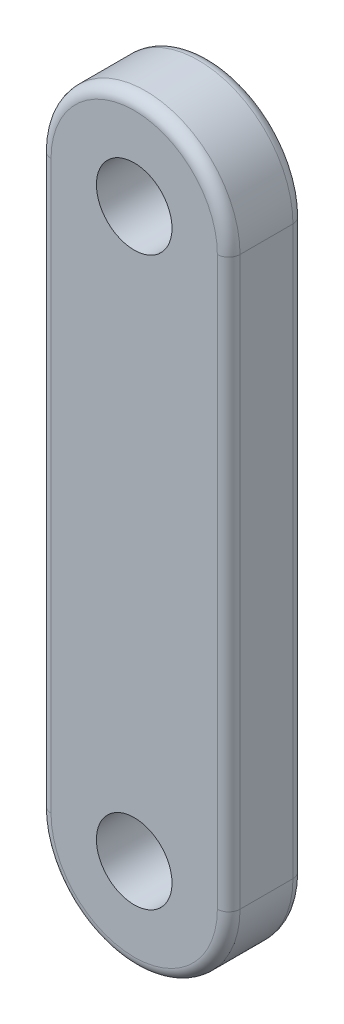
ISO-10303-21;
HEADER;
FILE_DESCRIPTION(('STEP AP214'),'2;1');
FILE_NAME('part.step','',(''),(''),'','','');
FILE_SCHEMA(('AUTOMOTIVE_DESIGN { 1 0 10303 214 1 1 1 1 }'));
ENDSEC;
DATA;
#1=APPLICATION_CONTEXT('core data for automotive mechanical design processes');
#2=APPLICATION_PROTOCOL_DEFINITION('international standard','automotive_design',2000,#1);
#3=PRODUCT_CONTEXT('',#1,'mechanical');
#4=PRODUCT('Part','Part','',(#3));
#5=PRODUCT_RELATED_PRODUCT_CATEGORY('part','',(#4));
#6=PRODUCT_DEFINITION_FORMATION('','',#4);
#7=PRODUCT_DEFINITION_CONTEXT('part definition',#1,'design');
#8=PRODUCT_DEFINITION('design','',#6,#7);
#9=PRODUCT_DEFINITION_SHAPE('','',#8);
#10=(LENGTH_UNIT() NAMED_UNIT(*) SI_UNIT(.MILLI.,.METRE.));
#11=(NAMED_UNIT(*) PLANE_ANGLE_UNIT() SI_UNIT($,.RADIAN.));
#12=(NAMED_UNIT(*) SI_UNIT($,.STERADIAN.) SOLID_ANGLE_UNIT());
#13=UNCERTAINTY_MEASURE_WITH_UNIT(LENGTH_MEASURE(1.E-05),#10,'distance_accuracy_value','');
#14=(GEOMETRIC_REPRESENTATION_CONTEXT(3) GLOBAL_UNCERTAINTY_ASSIGNED_CONTEXT((#13)) GLOBAL_UNIT_ASSIGNED_CONTEXT((#10,
#11,#12)) REPRESENTATION_CONTEXT('',''));
#15=CARTESIAN_POINT('',(0.,0.,0.));
#16=DIRECTION('',(0.,0.,1.));
#17=DIRECTION('',(1.,0.,0.));
#18=AXIS2_PLACEMENT_3D('',#15,#16,#17);
#19=CARTESIAN_POINT('',(-20.,1.02941176470588,2.));
#20=DIRECTION('',(0.,0.,1.));
#21=DIRECTION('',(1.,0.,0.));
#22=AXIS2_PLACEMENT_3D('',#19,#20,#21);
#23=PLANE('',#22);
#24=DIRECTION('',(0.,-1.,0.));
#25=VECTOR('',#24,1.);
#26=CARTESIAN_POINT('',(-22.2,1.02941176470588,2.));
#27=LINE('',#26,#25);
#28=CARTESIAN_POINT('',(-22.2,16.0294117647059,2.));
#29=VERTEX_POINT('',#28);
#30=CARTESIAN_POINT('',(-22.2,1.02941176470588,2.));
#31=VERTEX_POINT('',#30);
#32=EDGE_CURVE('E134',#29,#31,#27,.T.);
#33=ORIENTED_EDGE('',*,*,#32,.T.);
#34=CARTESIAN_POINT('',(-20.,1.02941176470588,2.));
#35=DIRECTION('',(0.,0.,1.));
#36=DIRECTION('',(1.,0.,0.));
#37=AXIS2_PLACEMENT_3D('',#34,#35,#36);
#38=CIRCLE('',#37,2.2);
#39=CARTESIAN_POINT('',(-17.8,1.02941176470588,2.));
#40=VERTEX_POINT('',#39);
#41=EDGE_CURVE('E113',#31,#40,#38,.T.);
#42=ORIENTED_EDGE('',*,*,#41,.T.);
#43=DIRECTION('',(0.,1.,0.));
#44=VECTOR('',#43,1.);
#45=CARTESIAN_POINT('',(-17.8,16.0294117647059,2.));
#46=LINE('',#45,#44);
#47=CARTESIAN_POINT('',(-17.8,16.0294117647059,2.));
#48=VERTEX_POINT('',#47);
#49=EDGE_CURVE('E122',#40,#48,#46,.T.);
#50=ORIENTED_EDGE('',*,*,#49,.T.);
#51=CARTESIAN_POINT('',(-20.,16.0294117647059,2.));
#52=DIRECTION('',(0.,0.,1.));
#53=DIRECTION('',(1.,0.,0.));
#54=AXIS2_PLACEMENT_3D('',#51,#52,#53);
#55=CIRCLE('',#54,2.2);
#56=EDGE_CURVE('E129',#48,#29,#55,.T.);
#57=ORIENTED_EDGE('',*,*,#56,.T.);
#58=EDGE_LOOP('',(#33,#42,#50,#57));
#59=FACE_BOUND('',#58,.T.);
#60=CARTESIAN_POINT('',(-20.,16.0294117647059,2.));
#61=DIRECTION('',(0.,0.,1.));
#62=DIRECTION('',(1.,0.,0.));
#63=AXIS2_PLACEMENT_3D('',#60,#61,#62);
#64=CIRCLE('',#63,0.999999999999998);
#65=CARTESIAN_POINT('',(-19.,16.0294117647059,2.));
#66=VERTEX_POINT('',#65);
#67=EDGE_CURVE('E237',#66,#66,#64,.T.);
#68=ORIENTED_EDGE('',*,*,#67,.F.);
#69=EDGE_LOOP('',(#68));
#70=FACE_BOUND('',#69,.T.);
#71=CARTESIAN_POINT('',(-20.,1.02941176470588,2.));
#72=DIRECTION('',(0.,0.,1.));
#73=DIRECTION('',(1.,0.,0.));
#74=AXIS2_PLACEMENT_3D('',#71,#72,#73);
#75=CIRCLE('',#74,0.999999999999998);
#76=CARTESIAN_POINT('',(-19.,1.02941176470588,2.));
#77=VERTEX_POINT('',#76);
#78=EDGE_CURVE('E247',#77,#77,#75,.T.);
#79=ORIENTED_EDGE('',*,*,#78,.F.);
#80=EDGE_LOOP('',(#79));
#81=FACE_BOUND('',#80,.T.);
#82=ADVANCED_FACE('F39',(#59,#70,#81),#23,.T.);
#83=CARTESIAN_POINT('',(-20.,1.02941176470588,0.));
#84=DIRECTION('',(0.,0.,1.));
#85=DIRECTION('',(1.,0.,0.));
#86=AXIS2_PLACEMENT_3D('',#83,#84,#85);
#87=PLANE('',#86);
#88=DIRECTION('',(0.,1.,0.));
#89=VECTOR('',#88,1.);
#90=CARTESIAN_POINT('',(-17.8,1.02941176470588,0.));
#91=LINE('',#90,#89);
#92=CARTESIAN_POINT('',(-17.8,16.0294117647059,0.));
#93=VERTEX_POINT('',#92);
#94=CARTESIAN_POINT('',(-17.8,1.02941176470588,0.));
#95=VERTEX_POINT('',#94);
#96=EDGE_CURVE('E160',#93,#95,#91,.F.);
#97=ORIENTED_EDGE('',*,*,#96,.T.);
#98=CARTESIAN_POINT('',(-20.,1.02941176470588,0.));
#99=DIRECTION('',(0.,0.,1.));
#100=DIRECTION('',(1.,0.,0.));
#101=AXIS2_PLACEMENT_3D('',#98,#99,#100);
#102=CIRCLE('',#101,2.2);
#103=CARTESIAN_POINT('',(-22.2,1.02941176470588,0.));
#104=VERTEX_POINT('',#103);
#105=EDGE_CURVE('E168',#95,#104,#102,.F.);
#106=ORIENTED_EDGE('',*,*,#105,.T.);
#107=DIRECTION('',(0.,-1.,0.));
#108=VECTOR('',#107,1.);
#109=CARTESIAN_POINT('',(-22.2,1.02941176470588,0.));
#110=LINE('',#109,#108);
#111=CARTESIAN_POINT('',(-22.2,16.0294117647059,0.));
#112=VERTEX_POINT('',#111);
#113=EDGE_CURVE('E64',#104,#112,#110,.F.);
#114=ORIENTED_EDGE('',*,*,#113,.T.);
#115=CARTESIAN_POINT('',(-20.,16.0294117647059,0.));
#116=DIRECTION('',(0.,0.,1.));
#117=DIRECTION('',(1.,0.,0.));
#118=AXIS2_PLACEMENT_3D('',#115,#116,#117);
#119=CIRCLE('',#118,2.2);
#120=EDGE_CURVE('E163',#112,#93,#119,.F.);
#121=ORIENTED_EDGE('',*,*,#120,.T.);
#122=EDGE_LOOP('',(#97,#106,#114,#121));
#123=FACE_BOUND('',#122,.T.);
#124=CARTESIAN_POINT('',(-20.,16.0294117647059,0.));
#125=DIRECTION('',(0.,0.,1.));
#126=DIRECTION('',(1.,0.,0.));
#127=AXIS2_PLACEMENT_3D('',#124,#125,#126);
#128=CIRCLE('',#127,0.999999999999998);
#129=CARTESIAN_POINT('',(-19.,16.0294117647059,0.));
#130=VERTEX_POINT('',#129);
#131=EDGE_CURVE('E242',#130,#130,#128,.T.);
#132=ORIENTED_EDGE('',*,*,#131,.T.);
#133=EDGE_LOOP('',(#132));
#134=FACE_BOUND('',#133,.T.);
#135=CARTESIAN_POINT('',(-20.,1.02941176470588,0.));
#136=DIRECTION('',(0.,0.,1.));
#137=DIRECTION('',(1.,0.,0.));
#138=AXIS2_PLACEMENT_3D('',#135,#136,#137);
#139=CIRCLE('',#138,0.999999999999998);
#140=CARTESIAN_POINT('',(-19.,1.02941176470588,0.));
#141=VERTEX_POINT('',#140);
#142=EDGE_CURVE('E181',#141,#141,#139,.T.);
#143=ORIENTED_EDGE('',*,*,#142,.T.);
#144=EDGE_LOOP('',(#143));
#145=FACE_BOUND('',#144,.T.);
#146=ADVANCED_FACE('F201',(#123,#134,#145),#87,.F.);
#147=CARTESIAN_POINT('',(-20.,1.02941176470588,2.));
#148=DIRECTION('',(0.,0.,-1.));
#149=DIRECTION('',(-1.,0.,0.));
#150=AXIS2_PLACEMENT_3D('',#147,#148,#149);
#151=CYLINDRICAL_SURFACE('',#150,2.5);
#152=DIRECTION('',(0.,0.,-1.));
#153=VECTOR('',#152,1.);
#154=CARTESIAN_POINT('',(-17.5,1.02941176470588,2.));
#155=LINE('',#154,#153);
#156=CARTESIAN_POINT('',(-17.5,1.02941176470588,1.7));
#157=VERTEX_POINT('',#156);
#158=CARTESIAN_POINT('',(-17.5,1.02941176470588,0.3));
#159=VERTEX_POINT('',#158);
#160=EDGE_CURVE('E130',#157,#159,#155,.T.);
#161=ORIENTED_EDGE('',*,*,#160,.F.);
#162=CARTESIAN_POINT('',(-20.,1.02941176470588,1.7));
#163=DIRECTION('',(0.,0.,1.));
#164=DIRECTION('',(1.,0.,0.));
#165=AXIS2_PLACEMENT_3D('',#162,#163,#164);
#166=CIRCLE('',#165,2.5);
#167=CARTESIAN_POINT('',(-22.5,1.02941176470588,1.7));
#168=VERTEX_POINT('',#167);
#169=EDGE_CURVE('E115',#157,#168,#166,.F.);
#170=ORIENTED_EDGE('',*,*,#169,.T.);
#171=DIRECTION('',(0.,0.,-1.));
#172=VECTOR('',#171,1.);
#173=CARTESIAN_POINT('',(-22.5,1.02941176470588,2.));
#174=LINE('',#173,#172);
#175=CARTESIAN_POINT('',(-22.5,1.02941176470588,0.3));
#176=VERTEX_POINT('',#175);
#177=EDGE_CURVE('E215',#168,#176,#174,.T.);
#178=ORIENTED_EDGE('',*,*,#177,.T.);
#179=CARTESIAN_POINT('',(-20.,1.02941176470588,0.3));
#180=DIRECTION('',(0.,0.,1.));
#181=DIRECTION('',(1.,0.,0.));
#182=AXIS2_PLACEMENT_3D('',#179,#180,#181);
#183=CIRCLE('',#182,2.5);
#184=EDGE_CURVE('E137',#176,#159,#183,.T.);
#185=ORIENTED_EDGE('',*,*,#184,.T.);
#186=EDGE_LOOP('',(#161,#170,#178,#185));
#187=FACE_BOUND('',#186,.T.);
#188=ADVANCED_FACE('F213',(#187),#151,.T.);
#189=CARTESIAN_POINT('',(-17.5,1.02941176470588,2.));
#190=DIRECTION('',(-1.,0.,0.));
#191=DIRECTION('',(0.,-1.,0.));
#192=AXIS2_PLACEMENT_3D('',#189,#190,#191);
#193=PLANE('',#192);
#194=DIRECTION('',(0.,0.,-1.));
#195=VECTOR('',#194,1.);
#196=CARTESIAN_POINT('',(-17.5,16.0294117647059,2.));
#197=LINE('',#196,#195);
#198=CARTESIAN_POINT('',(-17.5,16.0294117647059,1.7));
#199=VERTEX_POINT('',#198);
#200=CARTESIAN_POINT('',(-17.5,16.0294117647059,0.3));
#201=VERTEX_POINT('',#200);
#202=EDGE_CURVE('E218',#199,#201,#197,.T.);
#203=ORIENTED_EDGE('',*,*,#202,.F.);
#204=DIRECTION('',(0.,1.,0.));
#205=VECTOR('',#204,1.);
#206=CARTESIAN_POINT('',(-17.5,1.02941176470588,1.7));
#207=LINE('',#206,#205);
#208=EDGE_CURVE('E11',#199,#157,#207,.F.);
#209=ORIENTED_EDGE('',*,*,#208,.T.);
#210=ORIENTED_EDGE('',*,*,#160,.T.);
#211=DIRECTION('',(0.,1.,0.));
#212=VECTOR('',#211,1.);
#213=CARTESIAN_POINT('',(-17.5,1.02941176470588,0.3));
#214=LINE('',#213,#212);
#215=EDGE_CURVE('E49',#159,#201,#214,.T.);
#216=ORIENTED_EDGE('',*,*,#215,.T.);
#217=EDGE_LOOP('',(#203,#209,#210,#216));
#218=FACE_BOUND('',#217,.T.);
#219=ADVANCED_FACE('F216',(#218),#193,.F.);
#220=CARTESIAN_POINT('',(-20.,16.0294117647059,2.));
#221=DIRECTION('',(0.,0.,-1.));
#222=DIRECTION('',(-1.,0.,0.));
#223=AXIS2_PLACEMENT_3D('',#220,#221,#222);
#224=CYLINDRICAL_SURFACE('',#223,2.5);
#225=DIRECTION('',(0.,0.,-1.));
#226=VECTOR('',#225,1.);
#227=CARTESIAN_POINT('',(-22.5,16.0294117647059,2.));
#228=LINE('',#227,#226);
#229=CARTESIAN_POINT('',(-22.5,16.0294117647059,1.7));
#230=VERTEX_POINT('',#229);
#231=CARTESIAN_POINT('',(-22.5,16.0294117647059,0.3));
#232=VERTEX_POINT('',#231);
#233=EDGE_CURVE('E221',#230,#232,#228,.T.);
#234=ORIENTED_EDGE('',*,*,#233,.F.);
#235=CARTESIAN_POINT('',(-20.,16.0294117647059,1.7));
#236=DIRECTION('',(0.,0.,1.));
#237=DIRECTION('',(1.,0.,0.));
#238=AXIS2_PLACEMENT_3D('',#235,#236,#237);
#239=CIRCLE('',#238,2.5);
#240=EDGE_CURVE('E157',#230,#199,#239,.F.);
#241=ORIENTED_EDGE('',*,*,#240,.T.);
#242=ORIENTED_EDGE('',*,*,#202,.T.);
#243=CARTESIAN_POINT('',(-20.,16.0294117647059,0.3));
#244=DIRECTION('',(0.,0.,1.));
#245=DIRECTION('',(1.,0.,0.));
#246=AXIS2_PLACEMENT_3D('',#243,#244,#245);
#247=CIRCLE('',#246,2.5);
#248=EDGE_CURVE('E154',#201,#232,#247,.T.);
#249=ORIENTED_EDGE('',*,*,#248,.T.);
#250=EDGE_LOOP('',(#234,#241,#242,#249));
#251=FACE_BOUND('',#250,.T.);
#252=ADVANCED_FACE('F271',(#251),#224,.T.);
#253=CARTESIAN_POINT('',(-22.5,1.02941176470588,2.));
#254=DIRECTION('',(1.,0.,0.));
#255=DIRECTION('',(0.,0.,-1.));
#256=AXIS2_PLACEMENT_3D('',#253,#254,#255);
#257=PLANE('',#256);
#258=ORIENTED_EDGE('',*,*,#177,.F.);
#259=DIRECTION('',(0.,-1.,0.));
#260=VECTOR('',#259,1.);
#261=CARTESIAN_POINT('',(-22.5,16.0294117647059,1.7));
#262=LINE('',#261,#260);
#263=EDGE_CURVE('E151',#168,#230,#262,.F.);
#264=ORIENTED_EDGE('',*,*,#263,.T.);
#265=ORIENTED_EDGE('',*,*,#233,.T.);
#266=DIRECTION('',(0.,-1.,0.));
#267=VECTOR('',#266,1.);
#268=CARTESIAN_POINT('',(-22.5,1.02941176470588,0.3));
#269=LINE('',#268,#267);
#270=EDGE_CURVE('E148',#232,#176,#269,.T.);
#271=ORIENTED_EDGE('',*,*,#270,.T.);
#272=EDGE_LOOP('',(#258,#264,#265,#271));
#273=FACE_BOUND('',#272,.T.);
#274=ADVANCED_FACE('F235',(#273),#257,.F.);
#275=CARTESIAN_POINT('',(-20.,16.0294117647059,2.));
#276=DIRECTION('',(0.,0.,-1.));
#277=DIRECTION('',(-1.,0.,0.));
#278=AXIS2_PLACEMENT_3D('',#275,#276,#277);
#279=CYLINDRICAL_SURFACE('',#278,0.999999999999998);
#280=ORIENTED_EDGE('',*,*,#67,.T.);
#281=EDGE_LOOP('',(#280));
#282=FACE_BOUND('',#281,.T.);
#283=ORIENTED_EDGE('',*,*,#131,.F.);
#284=EDGE_LOOP('',(#283));
#285=FACE_BOUND('',#284,.T.);
#286=ADVANCED_FACE('F266',(#282,#285),#279,.F.);
#287=CARTESIAN_POINT('',(-20.,1.02941176470588,2.));
#288=DIRECTION('',(0.,0.,-1.));
#289=DIRECTION('',(-1.,0.,0.));
#290=AXIS2_PLACEMENT_3D('',#287,#288,#289);
#291=CYLINDRICAL_SURFACE('',#290,0.999999999999998);
#292=ORIENTED_EDGE('',*,*,#78,.T.);
#293=EDGE_LOOP('',(#292));
#294=FACE_BOUND('',#293,.T.);
#295=ORIENTED_EDGE('',*,*,#142,.F.);
#296=EDGE_LOOP('',(#295));
#297=FACE_BOUND('',#296,.T.);
#298=ADVANCED_FACE('F256',(#294,#297),#291,.F.);
#299=CARTESIAN_POINT('',(-20.,16.0294117647059,1.7));
#300=DIRECTION('',(0.,0.,1.));
#301=DIRECTION('',(1.,0.,0.));
#302=AXIS2_PLACEMENT_3D('',#299,#300,#301);
#303=TOROIDAL_SURFACE('',#302,2.2,0.3);
#304=CARTESIAN_POINT('',(-17.8,16.0294117647059,1.7));
#305=DIRECTION('',(0.,-1.,0.));
#306=DIRECTION('',(0.,0.,-1.));
#307=AXIS2_PLACEMENT_3D('',#304,#305,#306);
#308=CIRCLE('',#307,0.3);
#309=EDGE_CURVE('E125',#199,#48,#308,.T.);
#310=ORIENTED_EDGE('',*,*,#309,.F.);
#311=ORIENTED_EDGE('',*,*,#240,.F.);
#312=CARTESIAN_POINT('',(-22.2,16.0294117647059,1.7));
#313=DIRECTION('',(0.,-1.,0.));
#314=DIRECTION('',(0.,0.,-1.));
#315=AXIS2_PLACEMENT_3D('',#312,#313,#314);
#316=CIRCLE('',#315,0.3);
#317=EDGE_CURVE('E177',#29,#230,#316,.T.);
#318=ORIENTED_EDGE('',*,*,#317,.F.);
#319=ORIENTED_EDGE('',*,*,#56,.F.);
#320=EDGE_LOOP('',(#310,#311,#318,#319));
#321=FACE_BOUND('',#320,.T.);
#322=ADVANCED_FACE('F228',(#321),#303,.T.);
#323=CARTESIAN_POINT('',(-22.2,1.02941176470588,1.7));
#324=DIRECTION('',(0.,1.,0.));
#325=DIRECTION('',(0.,0.,1.));
#326=AXIS2_PLACEMENT_3D('',#323,#324,#325);
#327=CYLINDRICAL_SURFACE('',#326,0.3);
#328=ORIENTED_EDGE('',*,*,#317,.T.);
#329=ORIENTED_EDGE('',*,*,#263,.F.);
#330=CARTESIAN_POINT('',(-22.2,1.02941176470588,1.7));
#331=DIRECTION('',(0.,-1.,0.));
#332=DIRECTION('',(0.,0.,-1.));
#333=AXIS2_PLACEMENT_3D('',#330,#331,#332);
#334=CIRCLE('',#333,0.3);
#335=EDGE_CURVE('E119',#31,#168,#334,.T.);
#336=ORIENTED_EDGE('',*,*,#335,.F.);
#337=ORIENTED_EDGE('',*,*,#32,.F.);
#338=EDGE_LOOP('',(#328,#329,#336,#337));
#339=FACE_BOUND('',#338,.T.);
#340=ADVANCED_FACE('F231',(#339),#327,.T.);
#341=CARTESIAN_POINT('',(-17.8,1.02941176470588,1.7));
#342=DIRECTION('',(0.,-1.,0.));
#343=DIRECTION('',(1.,0.,0.));
#344=AXIS2_PLACEMENT_3D('',#341,#342,#343);
#345=CYLINDRICAL_SURFACE('',#344,0.3);
#346=ORIENTED_EDGE('',*,*,#309,.T.);
#347=ORIENTED_EDGE('',*,*,#49,.F.);
#348=CARTESIAN_POINT('',(-17.8,1.02941176470588,1.7));
#349=DIRECTION('',(0.,-1.,0.));
#350=DIRECTION('',(0.,0.,-1.));
#351=AXIS2_PLACEMENT_3D('',#348,#349,#350);
#352=CIRCLE('',#351,0.3);
#353=EDGE_CURVE('E109',#157,#40,#352,.T.);
#354=ORIENTED_EDGE('',*,*,#353,.F.);
#355=ORIENTED_EDGE('',*,*,#208,.F.);
#356=EDGE_LOOP('',(#346,#347,#354,#355));
#357=FACE_BOUND('',#356,.T.);
#358=ADVANCED_FACE('F123',(#357),#345,.T.);
#359=CARTESIAN_POINT('',(-20.,1.02941176470588,1.7));
#360=DIRECTION('',(0.,0.,1.));
#361=DIRECTION('',(1.,0.,0.));
#362=AXIS2_PLACEMENT_3D('',#359,#360,#361);
#363=TOROIDAL_SURFACE('',#362,2.2,0.3);
#364=ORIENTED_EDGE('',*,*,#335,.T.);
#365=ORIENTED_EDGE('',*,*,#169,.F.);
#366=ORIENTED_EDGE('',*,*,#353,.T.);
#367=ORIENTED_EDGE('',*,*,#41,.F.);
#368=EDGE_LOOP('',(#364,#365,#366,#367));
#369=FACE_BOUND('',#368,.T.);
#370=ADVANCED_FACE('F111',(#369),#363,.T.);
#371=CARTESIAN_POINT('',(-20.,16.0294117647059,0.3));
#372=DIRECTION('',(0.,0.,1.));
#373=DIRECTION('',(1.,0.,0.));
#374=AXIS2_PLACEMENT_3D('',#371,#372,#373);
#375=TOROIDAL_SURFACE('',#374,2.2,0.3);
#376=CARTESIAN_POINT('',(-17.8,16.0294117647059,0.3));
#377=DIRECTION('',(0.,-1.,0.));
#378=DIRECTION('',(0.,0.,-1.));
#379=AXIS2_PLACEMENT_3D('',#376,#377,#378);
#380=CIRCLE('',#379,0.3);
#381=EDGE_CURVE('E186',#93,#201,#380,.T.);
#382=ORIENTED_EDGE('',*,*,#381,.F.);
#383=ORIENTED_EDGE('',*,*,#120,.F.);
#384=CARTESIAN_POINT('',(-22.2,16.0294117647059,0.3));
#385=DIRECTION('',(0.,-1.,0.));
#386=DIRECTION('',(0.,0.,-1.));
#387=AXIS2_PLACEMENT_3D('',#384,#385,#386);
#388=CIRCLE('',#387,0.3);
#389=EDGE_CURVE('E43',#232,#112,#388,.T.);
#390=ORIENTED_EDGE('',*,*,#389,.F.);
#391=ORIENTED_EDGE('',*,*,#248,.F.);
#392=EDGE_LOOP('',(#382,#383,#390,#391));
#393=FACE_BOUND('',#392,.T.);
#394=ADVANCED_FACE('F41',(#393),#375,.T.);
#395=CARTESIAN_POINT('',(-22.2,1.02941176470588,0.3));
#396=DIRECTION('',(0.,-1.,0.));
#397=DIRECTION('',(0.,0.,-1.));
#398=AXIS2_PLACEMENT_3D('',#395,#396,#397);
#399=CYLINDRICAL_SURFACE('',#398,0.3);
#400=ORIENTED_EDGE('',*,*,#389,.T.);
#401=ORIENTED_EDGE('',*,*,#113,.F.);
#402=CARTESIAN_POINT('',(-22.2,1.02941176470588,0.3));
#403=DIRECTION('',(0.,-1.,0.));
#404=DIRECTION('',(0.,0.,-1.));
#405=AXIS2_PLACEMENT_3D('',#402,#403,#404);
#406=CIRCLE('',#405,0.3);
#407=EDGE_CURVE('E57',#176,#104,#406,.T.);
#408=ORIENTED_EDGE('',*,*,#407,.F.);
#409=ORIENTED_EDGE('',*,*,#270,.F.);
#410=EDGE_LOOP('',(#400,#401,#408,#409));
#411=FACE_BOUND('',#410,.T.);
#412=ADVANCED_FACE('F198',(#411),#399,.T.);
#413=CARTESIAN_POINT('',(-17.8,1.02941176470588,0.3));
#414=DIRECTION('',(0.,1.,0.));
#415=DIRECTION('',(-1.,0.,0.));
#416=AXIS2_PLACEMENT_3D('',#413,#414,#415);
#417=CYLINDRICAL_SURFACE('',#416,0.3);
#418=ORIENTED_EDGE('',*,*,#381,.T.);
#419=ORIENTED_EDGE('',*,*,#215,.F.);
#420=CARTESIAN_POINT('',(-17.8,1.02941176470588,0.3));
#421=DIRECTION('',(0.,-1.,0.));
#422=DIRECTION('',(0.,0.,-1.));
#423=AXIS2_PLACEMENT_3D('',#420,#421,#422);
#424=CIRCLE('',#423,0.3);
#425=EDGE_CURVE('E182',#95,#159,#424,.T.);
#426=ORIENTED_EDGE('',*,*,#425,.F.);
#427=ORIENTED_EDGE('',*,*,#96,.F.);
#428=EDGE_LOOP('',(#418,#419,#426,#427));
#429=FACE_BOUND('',#428,.T.);
#430=ADVANCED_FACE('F205',(#429),#417,.T.);
#431=CARTESIAN_POINT('',(-20.,1.02941176470588,0.3));
#432=DIRECTION('',(0.,0.,1.));
#433=DIRECTION('',(1.,0.,0.));
#434=AXIS2_PLACEMENT_3D('',#431,#432,#433);
#435=TOROIDAL_SURFACE('',#434,2.2,0.3);
#436=ORIENTED_EDGE('',*,*,#407,.T.);
#437=ORIENTED_EDGE('',*,*,#105,.F.);
#438=ORIENTED_EDGE('',*,*,#425,.T.);
#439=ORIENTED_EDGE('',*,*,#184,.F.);
#440=EDGE_LOOP('',(#436,#437,#438,#439));
#441=FACE_BOUND('',#440,.T.);
#442=ADVANCED_FACE('F204',(#441),#435,.T.);
#443=CLOSED_SHELL('',(#82,#146,#188,#219,#252,#274,#286,#298,#322,#340,#358,#370,#394,#412,#430,#442));
#444=MANIFOLD_SOLID_BREP('B2',#443);
#445=ADVANCED_BREP_SHAPE_REPRESENTATION('',(#18,#444),#14);
#446=SHAPE_DEFINITION_REPRESENTATION(#9,#445);
ENDSEC;
END-ISO-10303-21;
